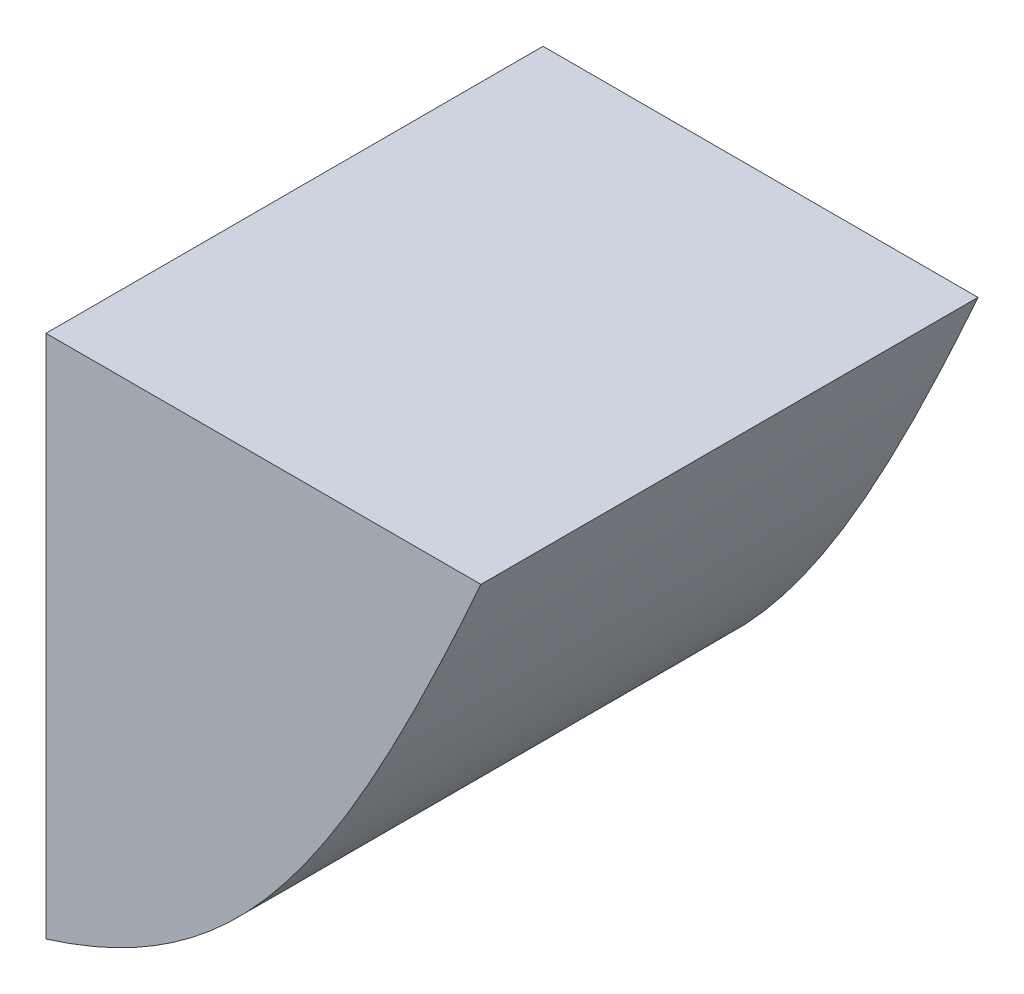
ISO-10303-21;
HEADER;
FILE_DESCRIPTION(('STEP AP214'),'2;1');
FILE_NAME('part.step','',(''),(''),'','','');
FILE_SCHEMA(('AUTOMOTIVE_DESIGN { 1 0 10303 214 1 1 1 1 }'));
ENDSEC;
DATA;
#1=APPLICATION_CONTEXT('core data for automotive mechanical design processes');
#2=APPLICATION_PROTOCOL_DEFINITION('international standard','automotive_design',2000,#1);
#3=PRODUCT_CONTEXT('',#1,'mechanical');
#4=PRODUCT('Part','Part','',(#3));
#5=PRODUCT_RELATED_PRODUCT_CATEGORY('part','',(#4));
#6=PRODUCT_DEFINITION_FORMATION('','',#4);
#7=PRODUCT_DEFINITION_CONTEXT('part definition',#1,'design');
#8=PRODUCT_DEFINITION('design','',#6,#7);
#9=PRODUCT_DEFINITION_SHAPE('','',#8);
#10=(LENGTH_UNIT() NAMED_UNIT(*) SI_UNIT(.MILLI.,.METRE.));
#11=(NAMED_UNIT(*) PLANE_ANGLE_UNIT() SI_UNIT($,.RADIAN.));
#12=(NAMED_UNIT(*) SI_UNIT($,.STERADIAN.) SOLID_ANGLE_UNIT());
#13=UNCERTAINTY_MEASURE_WITH_UNIT(LENGTH_MEASURE(1.E-05),#10,'distance_accuracy_value','');
#14=(GEOMETRIC_REPRESENTATION_CONTEXT(3) GLOBAL_UNCERTAINTY_ASSIGNED_CONTEXT((#13)) GLOBAL_UNIT_ASSIGNED_CONTEXT((#10,
#11,#12)) REPRESENTATION_CONTEXT('',''));
#15=CARTESIAN_POINT('',(0.,0.,0.));
#16=DIRECTION('',(0.,0.,1.));
#17=DIRECTION('',(1.,0.,0.));
#18=AXIS2_PLACEMENT_3D('',#15,#16,#17);
#19=CARTESIAN_POINT('',(0.,0.,8.));
#20=CARTESIAN_POINT('',(4.,0.,8.));
#21=CARTESIAN_POINT('',(8.,0.,8.));
#22=CARTESIAN_POINT('',(12.,9.,8.));
#23=(BOUNDED_CURVE() B_SPLINE_CURVE(3,(#19,#20,#21,#22),.UNSPECIFIED.,.F.,
.F.) B_SPLINE_CURVE_WITH_KNOTS((4,4),(0.,1.),
.UNSPECIFIED.) CURVE() GEOMETRIC_REPRESENTATION_ITEM() RATIONAL_B_SPLINE_CURVE((1.,0.75,1.25,1.)) REPRESENTATION_ITEM(''));
#24=DIRECTION('',(0.,0.,-1.));
#25=VECTOR('',#24,1.);
#26=SURFACE_OF_LINEAR_EXTRUSION('',#23,#25);
#27=DIRECTION('',(0.,0.,-1.));
#28=VECTOR('',#27,1.);
#29=CARTESIAN_POINT('',(5.,0.556460763676787,8.));
#30=LINE('',#29,#28);
#31=CARTESIAN_POINT('',(5.,0.556460763676786,0.));
#32=VERTEX_POINT('',#31);
#33=CARTESIAN_POINT('',(5.,0.556460763676786,8.));
#34=VERTEX_POINT('',#33);
#35=EDGE_CURVE('E76',#32,#34,#30,.F.);
#36=ORIENTED_EDGE('',*,*,#35,.F.);
#37=CARTESIAN_POINT('',(0.,0.,0.));
#38=CARTESIAN_POINT('',(4.,0.,0.));
#39=CARTESIAN_POINT('',(8.,0.,0.));
#40=CARTESIAN_POINT('',(12.,9.,0.));
#41=(BOUNDED_CURVE() B_SPLINE_CURVE(3,(#37,#38,#39,#40),.UNSPECIFIED.,.F.,
.F.) B_SPLINE_CURVE_WITH_KNOTS((4,4),(0.,1.),
.UNSPECIFIED.) CURVE() GEOMETRIC_REPRESENTATION_ITEM() RATIONAL_B_SPLINE_CURVE((1.,0.75,1.25,1.)) REPRESENTATION_ITEM(''));
#42=CARTESIAN_POINT('',(12.,9.,0.));
#43=VERTEX_POINT('',#42);
#44=EDGE_CURVE('E83',#32,#43,#41,.T.);
#45=ORIENTED_EDGE('',*,*,#44,.T.);
#46=DIRECTION('',(0.,0.,-1.));
#47=VECTOR('',#46,1.);
#48=CARTESIAN_POINT('',(12.,9.,8.));
#49=LINE('',#48,#47);
#50=CARTESIAN_POINT('',(12.,9.,8.));
#51=VERTEX_POINT('',#50);
#52=EDGE_CURVE('E49',#51,#43,#49,.T.);
#53=ORIENTED_EDGE('',*,*,#52,.F.);
#54=EDGE_CURVE('E64',#34,#51,#23,.T.);
#55=ORIENTED_EDGE('',*,*,#54,.F.);
#56=EDGE_LOOP('',(#36,#45,#53,#55));
#57=FACE_BOUND('',#56,.T.);
#58=ADVANCED_FACE('F41',(#57),#26,.F.);
#59=CARTESIAN_POINT('',(12.,9.,8.));
#60=DIRECTION('',(0.,-1.,0.));
#61=DIRECTION('',(0.,0.,-1.));
#62=AXIS2_PLACEMENT_3D('',#59,#60,#61);
#63=PLANE('',#62);
#64=DIRECTION('',(0.,0.,-1.));
#65=VECTOR('',#64,1.);
#66=CARTESIAN_POINT('',(5.,9.,8.));
#67=LINE('',#66,#65);
#68=CARTESIAN_POINT('',(5.,9.,8.));
#69=VERTEX_POINT('',#68);
#70=CARTESIAN_POINT('',(5.,9.,0.));
#71=VERTEX_POINT('',#70);
#72=EDGE_CURVE('E56',#69,#71,#67,.T.);
#73=ORIENTED_EDGE('',*,*,#72,.F.);
#74=DIRECTION('',(-1.,0.,0.));
#75=VECTOR('',#74,1.);
#76=CARTESIAN_POINT('',(12.,9.,8.));
#77=LINE('',#76,#75);
#78=EDGE_CURVE('E93',#51,#69,#77,.T.);
#79=ORIENTED_EDGE('',*,*,#78,.F.);
#80=ORIENTED_EDGE('',*,*,#52,.T.);
#81=DIRECTION('',(-1.,0.,0.));
#82=VECTOR('',#81,1.);
#83=CARTESIAN_POINT('',(12.,9.,0.));
#84=LINE('',#83,#82);
#85=EDGE_CURVE('E86',#43,#71,#84,.T.);
#86=ORIENTED_EDGE('',*,*,#85,.T.);
#87=EDGE_LOOP('',(#73,#79,#80,#86));
#88=FACE_BOUND('',#87,.T.);
#89=ADVANCED_FACE('F107',(#88),#63,.F.);
#90=CARTESIAN_POINT('',(6.375,1.125,8.));
#91=DIRECTION('',(0.,0.,-1.));
#92=DIRECTION('',(-1.,0.,0.));
#93=AXIS2_PLACEMENT_3D('',#90,#91,#92);
#94=PLANE('',#93);
#95=DIRECTION('',(0.,1.,0.));
#96=VECTOR('',#95,1.);
#97=CARTESIAN_POINT('',(5.,-2.,8.));
#98=LINE('',#97,#96);
#99=EDGE_CURVE('E106',#34,#69,#98,.T.);
#100=ORIENTED_EDGE('',*,*,#99,.F.);
#101=ORIENTED_EDGE('',*,*,#54,.T.);
#102=ORIENTED_EDGE('',*,*,#78,.T.);
#103=EDGE_LOOP('',(#100,#101,#102));
#104=FACE_BOUND('',#103,.T.);
#105=ADVANCED_FACE('F109',(#104),#94,.F.);
#106=CARTESIAN_POINT('',(6.375,1.125,0.));
#107=DIRECTION('',(0.,0.,-1.));
#108=DIRECTION('',(-1.,0.,0.));
#109=AXIS2_PLACEMENT_3D('',#106,#107,#108);
#110=PLANE('',#109);
#111=ORIENTED_EDGE('',*,*,#44,.F.);
#112=DIRECTION('',(0.,1.,0.));
#113=VECTOR('',#112,1.);
#114=CARTESIAN_POINT('',(5.,1.125,0.));
#115=LINE('',#114,#113);
#116=EDGE_CURVE('E11',#32,#71,#115,.T.);
#117=ORIENTED_EDGE('',*,*,#116,.T.);
#118=ORIENTED_EDGE('',*,*,#85,.F.);
#119=EDGE_LOOP('',(#111,#117,#118));
#120=FACE_BOUND('',#119,.T.);
#121=ADVANCED_FACE('F85',(#120),#110,.T.);
#122=CARTESIAN_POINT('',(5.,-2.,8.));
#123=DIRECTION('',(-1.,0.,0.));
#124=DIRECTION('',(0.,0.,1.));
#125=AXIS2_PLACEMENT_3D('',#122,#123,#124);
#126=PLANE('',#125);
#127=ORIENTED_EDGE('',*,*,#35,.T.);
#128=ORIENTED_EDGE('',*,*,#99,.T.);
#129=ORIENTED_EDGE('',*,*,#72,.T.);
#130=ORIENTED_EDGE('',*,*,#116,.F.);
#131=EDGE_LOOP('',(#127,#128,#129,#130));
#132=FACE_BOUND('',#131,.T.);
#133=ADVANCED_FACE('F75',(#132),#126,.T.);
#134=CLOSED_SHELL('',(#58,#89,#105,#121,#133));
#135=MANIFOLD_SOLID_BREP('B2',#134);
#136=ADVANCED_BREP_SHAPE_REPRESENTATION('',(#18,#135),#14);
#137=SHAPE_DEFINITION_REPRESENTATION(#9,#136);
ENDSEC;
END-ISO-10303-21;
